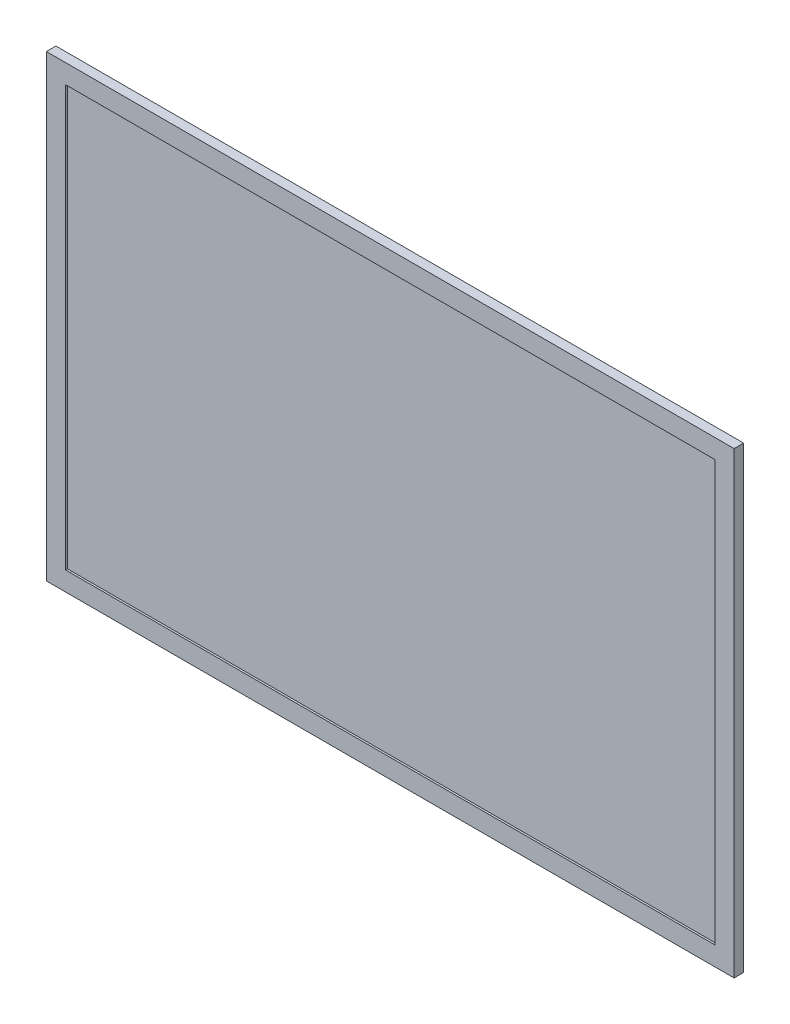
ISO-10303-21;
HEADER;
FILE_DESCRIPTION(('STEP AP214'),'2;1');
FILE_NAME('part.step','',(''),(''),'','','');
FILE_SCHEMA(('AUTOMOTIVE_DESIGN { 1 0 10303 214 1 1 1 1 }'));
ENDSEC;
DATA;
#1=APPLICATION_CONTEXT('core data for automotive mechanical design processes');
#2=APPLICATION_PROTOCOL_DEFINITION('international standard','automotive_design',2000,#1);
#3=PRODUCT_CONTEXT('',#1,'mechanical');
#4=PRODUCT('Part','Part','',(#3));
#5=PRODUCT_RELATED_PRODUCT_CATEGORY('part','',(#4));
#6=PRODUCT_DEFINITION_FORMATION('','',#4);
#7=PRODUCT_DEFINITION_CONTEXT('part definition',#1,'design');
#8=PRODUCT_DEFINITION('design','',#6,#7);
#9=PRODUCT_DEFINITION_SHAPE('','',#8);
#10=(LENGTH_UNIT() NAMED_UNIT(*) SI_UNIT(.MILLI.,.METRE.));
#11=(NAMED_UNIT(*) PLANE_ANGLE_UNIT() SI_UNIT($,.RADIAN.));
#12=(NAMED_UNIT(*) SI_UNIT($,.STERADIAN.) SOLID_ANGLE_UNIT());
#13=UNCERTAINTY_MEASURE_WITH_UNIT(LENGTH_MEASURE(1.E-05),#10,'distance_accuracy_value','');
#14=(GEOMETRIC_REPRESENTATION_CONTEXT(3) GLOBAL_UNCERTAINTY_ASSIGNED_CONTEXT((#13)) GLOBAL_UNIT_ASSIGNED_CONTEXT((#10,
#11,#12)) REPRESENTATION_CONTEXT('',''));
#15=CARTESIAN_POINT('',(0.,0.,0.));
#16=DIRECTION('',(0.,0.,1.));
#17=DIRECTION('',(1.,0.,0.));
#18=AXIS2_PLACEMENT_3D('',#15,#16,#17);
#19=CARTESIAN_POINT('',(914.41,-0.0100000000000122,0.));
#20=DIRECTION('',(0.,0.,-1.));
#21=DIRECTION('',(-1.,0.,0.));
#22=AXIS2_PLACEMENT_3D('',#19,#20,#21);
#23=PLANE('',#22);
#24=DIRECTION('',(-1.,0.,0.));
#25=VECTOR('',#24,1.);
#26=CARTESIAN_POINT('',(457.2,609.6,0.));
#27=LINE('',#26,#25);
#28=CARTESIAN_POINT('',(914.4,609.6,0.));
#29=VERTEX_POINT('',#28);
#30=CARTESIAN_POINT('',(-1.31442170628223E-13,609.6,0.));
#31=VERTEX_POINT('',#30);
#32=EDGE_CURVE('E80',#29,#31,#27,.T.);
#33=ORIENTED_EDGE('',*,*,#32,.F.);
#34=DIRECTION('',(0.,1.,0.));
#35=VECTOR('',#34,1.);
#36=CARTESIAN_POINT('',(914.4,304.8,0.));
#37=LINE('',#36,#35);
#38=CARTESIAN_POINT('',(914.4,0.,0.));
#39=VERTEX_POINT('',#38);
#40=EDGE_CURVE('E82',#39,#29,#37,.T.);
#41=ORIENTED_EDGE('',*,*,#40,.F.);
#42=DIRECTION('',(1.,0.,0.));
#43=VECTOR('',#42,1.);
#44=CARTESIAN_POINT('',(457.2,0.,0.));
#45=LINE('',#44,#43);
#46=CARTESIAN_POINT('',(0.,0.,0.));
#47=VERTEX_POINT('',#46);
#48=EDGE_CURVE('E21',#47,#39,#45,.T.);
#49=ORIENTED_EDGE('',*,*,#48,.F.);
#50=DIRECTION('',(0.,-1.,0.));
#51=VECTOR('',#50,1.);
#52=CARTESIAN_POINT('',(0.,304.8,0.));
#53=LINE('',#52,#51);
#54=EDGE_CURVE('E104',#31,#47,#53,.T.);
#55=ORIENTED_EDGE('',*,*,#54,.F.);
#56=EDGE_LOOP('',(#33,#41,#49,#55));
#57=FACE_BOUND('',#56,.T.);
#58=ADVANCED_FACE('F17',(#57),#23,.T.);
#59=CARTESIAN_POINT('',(-0.01,0.,-0.01));
#60=DIRECTION('',(0.,-1.,0.));
#61=DIRECTION('',(1.,0.,0.));
#62=AXIS2_PLACEMENT_3D('',#59,#60,#61);
#63=PLANE('',#62);
#64=DIRECTION('',(1.,0.,0.));
#65=VECTOR('',#64,1.);
#66=CARTESIAN_POINT('',(457.2,0.,12.7));
#67=LINE('',#66,#65);
#68=CARTESIAN_POINT('',(0.,0.,12.7));
#69=VERTEX_POINT('',#68);
#70=CARTESIAN_POINT('',(914.4,0.,12.7));
#71=VERTEX_POINT('',#70);
#72=EDGE_CURVE('E110',#69,#71,#67,.T.);
#73=ORIENTED_EDGE('',*,*,#72,.F.);
#74=DIRECTION('',(0.,0.,1.));
#75=VECTOR('',#74,1.);
#76=CARTESIAN_POINT('',(0.,0.,6.35));
#77=LINE('',#76,#75);
#78=EDGE_CURVE('E93',#47,#69,#77,.T.);
#79=ORIENTED_EDGE('',*,*,#78,.F.);
#80=ORIENTED_EDGE('',*,*,#48,.T.);
#81=DIRECTION('',(0.,0.,-1.));
#82=VECTOR('',#81,1.);
#83=CARTESIAN_POINT('',(914.4,0.,6.35));
#84=LINE('',#83,#82);
#85=EDGE_CURVE('E88',#71,#39,#84,.T.);
#86=ORIENTED_EDGE('',*,*,#85,.F.);
#87=EDGE_LOOP('',(#73,#79,#80,#86));
#88=FACE_BOUND('',#87,.T.);
#89=ADVANCED_FACE('F90',(#88),#63,.T.);
#90=CARTESIAN_POINT('',(914.4,-0.01,-0.01));
#91=DIRECTION('',(1.,0.,0.));
#92=DIRECTION('',(0.,1.,0.));
#93=AXIS2_PLACEMENT_3D('',#90,#91,#92);
#94=PLANE('',#93);
#95=DIRECTION('',(0.,1.,0.));
#96=VECTOR('',#95,1.);
#97=CARTESIAN_POINT('',(914.4,304.8,12.7));
#98=LINE('',#97,#96);
#99=CARTESIAN_POINT('',(914.4,609.6,12.7));
#100=VERTEX_POINT('',#99);
#101=EDGE_CURVE('E97',#71,#100,#98,.T.);
#102=ORIENTED_EDGE('',*,*,#101,.F.);
#103=ORIENTED_EDGE('',*,*,#85,.T.);
#104=ORIENTED_EDGE('',*,*,#40,.T.);
#105=DIRECTION('',(0.,0.,-1.));
#106=VECTOR('',#105,1.);
#107=CARTESIAN_POINT('',(914.4,609.6,6.35));
#108=LINE('',#107,#106);
#109=EDGE_CURVE('E100',#100,#29,#108,.T.);
#110=ORIENTED_EDGE('',*,*,#109,.F.);
#111=EDGE_LOOP('',(#102,#103,#104,#110));
#112=FACE_BOUND('',#111,.T.);
#113=ADVANCED_FACE('F95',(#112),#94,.T.);
#114=CARTESIAN_POINT('',(914.41,609.6,-0.01));
#115=DIRECTION('',(0.,1.,0.));
#116=DIRECTION('',(-1.,0.,0.));
#117=AXIS2_PLACEMENT_3D('',#114,#115,#116);
#118=PLANE('',#117);
#119=DIRECTION('',(-1.,0.,0.));
#120=VECTOR('',#119,1.);
#121=CARTESIAN_POINT('',(457.2,609.6,12.7));
#122=LINE('',#121,#120);
#123=CARTESIAN_POINT('',(-1.90518060018E-13,609.6,12.7));
#124=VERTEX_POINT('',#123);
#125=EDGE_CURVE('E113',#100,#124,#122,.T.);
#126=ORIENTED_EDGE('',*,*,#125,.F.);
#127=ORIENTED_EDGE('',*,*,#109,.T.);
#128=ORIENTED_EDGE('',*,*,#32,.T.);
#129=DIRECTION('',(0.,0.,-1.));
#130=VECTOR('',#129,1.);
#131=CARTESIAN_POINT('',(-1.86636172190057E-13,609.6,6.35));
#132=LINE('',#131,#130);
#133=EDGE_CURVE('E107',#124,#31,#132,.T.);
#134=ORIENTED_EDGE('',*,*,#133,.F.);
#135=EDGE_LOOP('',(#126,#127,#128,#134));
#136=FACE_BOUND('',#135,.T.);
#137=ADVANCED_FACE('F166',(#136),#118,.T.);
#138=CARTESIAN_POINT('',(-1.86639233807055E-13,609.61,-0.01));
#139=DIRECTION('',(-1.,0.,0.));
#140=DIRECTION('',(0.,-1.,0.));
#141=AXIS2_PLACEMENT_3D('',#138,#139,#140);
#142=PLANE('',#141);
#143=DIRECTION('',(0.,-1.,0.));
#144=VECTOR('',#143,1.);
#145=CARTESIAN_POINT('',(-2.13155841176545E-13,304.8,12.7));
#146=LINE('',#145,#144);
#147=EDGE_CURVE('E116',#124,#69,#146,.T.);
#148=ORIENTED_EDGE('',*,*,#147,.F.);
#149=ORIENTED_EDGE('',*,*,#133,.T.);
#150=ORIENTED_EDGE('',*,*,#54,.T.);
#151=ORIENTED_EDGE('',*,*,#78,.T.);
#152=EDGE_LOOP('',(#148,#149,#150,#151));
#153=FACE_BOUND('',#152,.T.);
#154=ADVANCED_FACE('F168',(#153),#142,.T.);
#155=CARTESIAN_POINT('',(25.3999999999998,584.21,12.71));
#156=DIRECTION('',(1.,0.,0.));
#157=DIRECTION('',(0.,-1.,0.));
#158=AXIS2_PLACEMENT_3D('',#155,#156,#157);
#159=PLANE('',#158);
#160=DIRECTION('',(0.,-1.,0.));
#161=VECTOR('',#160,1.);
#162=CARTESIAN_POINT('',(25.3999999999997,304.8,10.16));
#163=LINE('',#162,#161);
#164=CARTESIAN_POINT('',(25.3999999999998,584.2,10.16));
#165=VERTEX_POINT('',#164);
#166=CARTESIAN_POINT('',(25.3999999999998,25.4,10.16));
#167=VERTEX_POINT('',#166);
#168=EDGE_CURVE('E129',#165,#167,#163,.T.);
#169=ORIENTED_EDGE('',*,*,#168,.F.);
#170=DIRECTION('',(0.,0.,-1.));
#171=VECTOR('',#170,1.);
#172=CARTESIAN_POINT('',(25.3999999999998,584.2,11.43));
#173=LINE('',#172,#171);
#174=CARTESIAN_POINT('',(25.3999999999999,584.2,12.7));
#175=VERTEX_POINT('',#174);
#176=EDGE_CURVE('E124',#175,#165,#173,.T.);
#177=ORIENTED_EDGE('',*,*,#176,.F.);
#178=DIRECTION('',(0.,1.,0.));
#179=VECTOR('',#178,1.);
#180=CARTESIAN_POINT('',(25.4,304.8,12.7));
#181=LINE('',#180,#179);
#182=CARTESIAN_POINT('',(25.4,25.4,12.7));
#183=VERTEX_POINT('',#182);
#184=EDGE_CURVE('E119',#183,#175,#181,.T.);
#185=ORIENTED_EDGE('',*,*,#184,.F.);
#186=DIRECTION('',(0.,0.,1.));
#187=VECTOR('',#186,1.);
#188=CARTESIAN_POINT('',(25.4,25.4,11.43));
#189=LINE('',#188,#187);
#190=EDGE_CURVE('E135',#167,#183,#189,.T.);
#191=ORIENTED_EDGE('',*,*,#190,.F.);
#192=EDGE_LOOP('',(#169,#177,#185,#191));
#193=FACE_BOUND('',#192,.T.);
#194=ADVANCED_FACE('F154',(#193),#159,.T.);
#195=CARTESIAN_POINT('',(-0.0100000000001899,-0.0100000000000122,12.7));
#196=DIRECTION('',(0.,0.,1.));
#197=DIRECTION('',(1.,0.,0.));
#198=AXIS2_PLACEMENT_3D('',#195,#196,#197);
#199=PLANE('',#198);
#200=ORIENTED_EDGE('',*,*,#184,.T.);
#201=DIRECTION('',(-1.,0.,0.));
#202=VECTOR('',#201,1.);
#203=CARTESIAN_POINT('',(457.2,584.2,12.7));
#204=LINE('',#203,#202);
#205=CARTESIAN_POINT('',(889.,584.2,12.7));
#206=VERTEX_POINT('',#205);
#207=EDGE_CURVE('E121',#206,#175,#204,.T.);
#208=ORIENTED_EDGE('',*,*,#207,.F.);
#209=DIRECTION('',(0.,1.,0.));
#210=VECTOR('',#209,1.);
#211=CARTESIAN_POINT('',(889.,304.8,12.7));
#212=LINE('',#211,#210);
#213=CARTESIAN_POINT('',(889.,25.4,12.7));
#214=VERTEX_POINT('',#213);
#215=EDGE_CURVE('E138',#214,#206,#212,.T.);
#216=ORIENTED_EDGE('',*,*,#215,.F.);
#217=DIRECTION('',(1.,0.,0.));
#218=VECTOR('',#217,1.);
#219=CARTESIAN_POINT('',(457.2,25.4,12.7));
#220=LINE('',#219,#218);
#221=EDGE_CURVE('E131',#183,#214,#220,.T.);
#222=ORIENTED_EDGE('',*,*,#221,.F.);
#223=EDGE_LOOP('',(#200,#208,#216,#222));
#224=FACE_BOUND('',#223,.T.);
#225=ORIENTED_EDGE('',*,*,#125,.T.);
#226=ORIENTED_EDGE('',*,*,#147,.T.);
#227=ORIENTED_EDGE('',*,*,#72,.T.);
#228=ORIENTED_EDGE('',*,*,#101,.T.);
#229=EDGE_LOOP('',(#225,#226,#227,#228));
#230=FACE_BOUND('',#229,.T.);
#231=ADVANCED_FACE('F159',(#224,#230),#199,.T.);
#232=CARTESIAN_POINT('',(889.01,584.2,12.71));
#233=DIRECTION('',(0.,-1.,0.));
#234=DIRECTION('',(-1.,0.,0.));
#235=AXIS2_PLACEMENT_3D('',#232,#233,#234);
#236=PLANE('',#235);
#237=DIRECTION('',(-1.,0.,0.));
#238=VECTOR('',#237,1.);
#239=CARTESIAN_POINT('',(457.2,584.2,10.16));
#240=LINE('',#239,#238);
#241=CARTESIAN_POINT('',(889.,584.2,10.16));
#242=VERTEX_POINT('',#241);
#243=EDGE_CURVE('E126',#242,#165,#240,.T.);
#244=ORIENTED_EDGE('',*,*,#243,.F.);
#245=DIRECTION('',(0.,0.,-1.));
#246=VECTOR('',#245,1.);
#247=CARTESIAN_POINT('',(889.,584.2,11.43));
#248=LINE('',#247,#246);
#249=EDGE_CURVE('E141',#206,#242,#248,.T.);
#250=ORIENTED_EDGE('',*,*,#249,.F.);
#251=ORIENTED_EDGE('',*,*,#207,.T.);
#252=ORIENTED_EDGE('',*,*,#176,.T.);
#253=EDGE_LOOP('',(#244,#250,#251,#252));
#254=FACE_BOUND('',#253,.T.);
#255=ADVANCED_FACE('F151',(#254),#236,.T.);
#256=CARTESIAN_POINT('',(25.3899999999998,25.39,10.16));
#257=DIRECTION('',(0.,0.,1.));
#258=DIRECTION('',(1.,0.,0.));
#259=AXIS2_PLACEMENT_3D('',#256,#257,#258);
#260=PLANE('',#259);
#261=ORIENTED_EDGE('',*,*,#243,.T.);
#262=ORIENTED_EDGE('',*,*,#168,.T.);
#263=DIRECTION('',(-1.,0.,0.));
#264=VECTOR('',#263,1.);
#265=CARTESIAN_POINT('',(457.2,25.4,10.16));
#266=LINE('',#265,#264);
#267=CARTESIAN_POINT('',(889.,25.4,10.16));
#268=VERTEX_POINT('',#267);
#269=EDGE_CURVE('E36',#268,#167,#266,.T.);
#270=ORIENTED_EDGE('',*,*,#269,.F.);
#271=DIRECTION('',(0.,-1.,0.));
#272=VECTOR('',#271,1.);
#273=CARTESIAN_POINT('',(889.,304.8,10.16));
#274=LINE('',#273,#272);
#275=EDGE_CURVE('E27',#242,#268,#274,.T.);
#276=ORIENTED_EDGE('',*,*,#275,.F.);
#277=EDGE_LOOP('',(#261,#262,#270,#276));
#278=FACE_BOUND('',#277,.T.);
#279=ADVANCED_FACE('F147',(#278),#260,.T.);
#280=CARTESIAN_POINT('',(25.39,25.4,12.71));
#281=DIRECTION('',(0.,1.,0.));
#282=DIRECTION('',(1.,0.,0.));
#283=AXIS2_PLACEMENT_3D('',#280,#281,#282);
#284=PLANE('',#283);
#285=ORIENTED_EDGE('',*,*,#269,.T.);
#286=ORIENTED_EDGE('',*,*,#190,.T.);
#287=ORIENTED_EDGE('',*,*,#221,.T.);
#288=DIRECTION('',(0.,0.,1.));
#289=VECTOR('',#288,1.);
#290=CARTESIAN_POINT('',(889.,25.4,11.43));
#291=LINE('',#290,#289);
#292=EDGE_CURVE('E11',#268,#214,#291,.T.);
#293=ORIENTED_EDGE('',*,*,#292,.F.);
#294=EDGE_LOOP('',(#285,#286,#287,#293));
#295=FACE_BOUND('',#294,.T.);
#296=ADVANCED_FACE('F157',(#295),#284,.T.);
#297=CARTESIAN_POINT('',(889.,25.3900000000001,12.71));
#298=DIRECTION('',(-1.,0.,0.));
#299=DIRECTION('',(0.,1.,0.));
#300=AXIS2_PLACEMENT_3D('',#297,#298,#299);
#301=PLANE('',#300);
#302=ORIENTED_EDGE('',*,*,#275,.T.);
#303=ORIENTED_EDGE('',*,*,#292,.T.);
#304=ORIENTED_EDGE('',*,*,#215,.T.);
#305=ORIENTED_EDGE('',*,*,#249,.T.);
#306=EDGE_LOOP('',(#302,#303,#304,#305));
#307=FACE_BOUND('',#306,.T.);
#308=ADVANCED_FACE('F19',(#307),#301,.T.);
#309=CLOSED_SHELL('',(#58,#89,#113,#137,#154,#194,#231,#255,#279,#296,#308));
#310=MANIFOLD_SOLID_BREP('B1',#309);
#311=ADVANCED_BREP_SHAPE_REPRESENTATION('',(#18,#310),#14);
#312=SHAPE_DEFINITION_REPRESENTATION(#9,#311);
ENDSEC;
END-ISO-10303-21;
